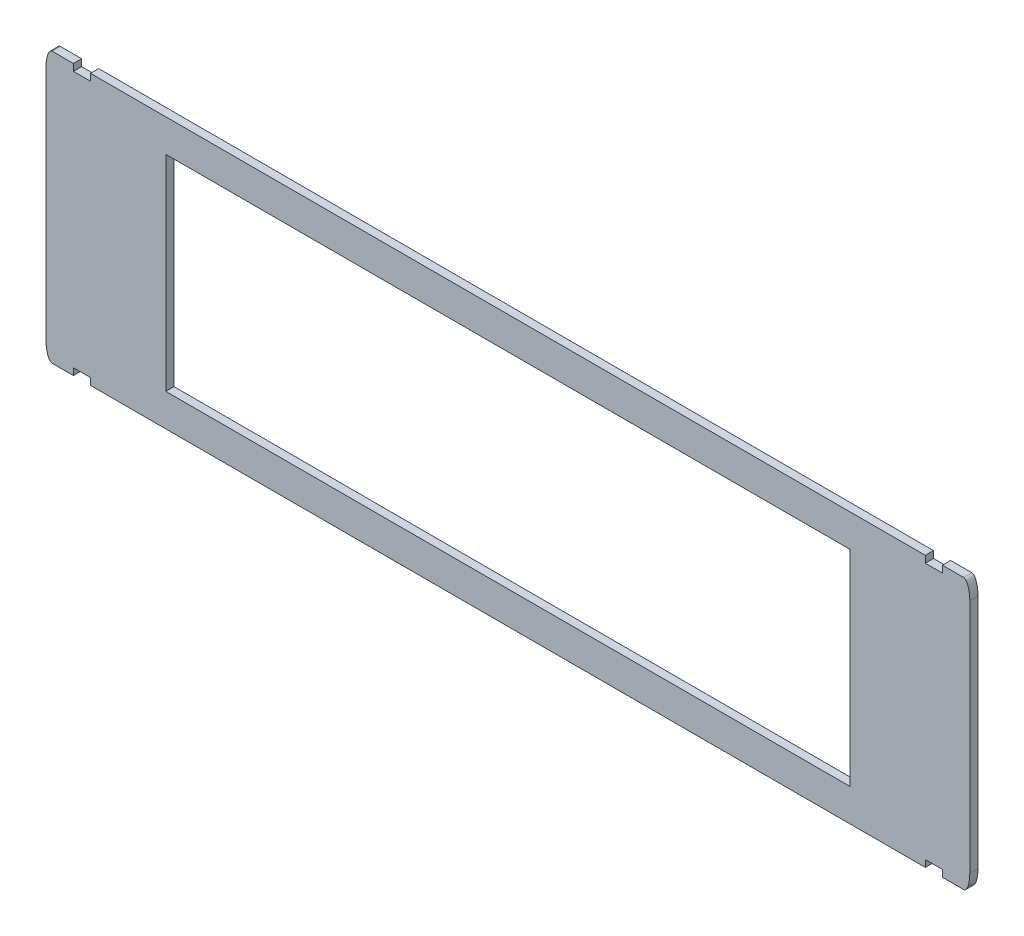
ISO-10303-21;
HEADER;
FILE_DESCRIPTION(('STEP AP214'),'2;1');
FILE_NAME('part.step','',(''),(''),'','','');
FILE_SCHEMA(('AUTOMOTIVE_DESIGN { 1 0 10303 214 1 1 1 1 }'));
ENDSEC;
DATA;
#1=APPLICATION_CONTEXT('core data for automotive mechanical design processes');
#2=APPLICATION_PROTOCOL_DEFINITION('international standard','automotive_design',2000,#1);
#3=PRODUCT_CONTEXT('',#1,'mechanical');
#4=PRODUCT('Part','Part','',(#3));
#5=PRODUCT_RELATED_PRODUCT_CATEGORY('part','',(#4));
#6=PRODUCT_DEFINITION_FORMATION('','',#4);
#7=PRODUCT_DEFINITION_CONTEXT('part definition',#1,'design');
#8=PRODUCT_DEFINITION('design','',#6,#7);
#9=PRODUCT_DEFINITION_SHAPE('','',#8);
#10=(LENGTH_UNIT() NAMED_UNIT(*) SI_UNIT(.MILLI.,.METRE.));
#11=(NAMED_UNIT(*) PLANE_ANGLE_UNIT() SI_UNIT($,.RADIAN.));
#12=(NAMED_UNIT(*) SI_UNIT($,.STERADIAN.) SOLID_ANGLE_UNIT());
#13=UNCERTAINTY_MEASURE_WITH_UNIT(LENGTH_MEASURE(1.E-05),#10,'distance_accuracy_value','');
#14=(GEOMETRIC_REPRESENTATION_CONTEXT(3) GLOBAL_UNCERTAINTY_ASSIGNED_CONTEXT((#13)) GLOBAL_UNIT_ASSIGNED_CONTEXT((#10,
#11,#12)) REPRESENTATION_CONTEXT('',''));
#15=CARTESIAN_POINT('',(0.,0.,0.));
#16=DIRECTION('',(0.,0.,1.));
#17=DIRECTION('',(1.,0.,0.));
#18=AXIS2_PLACEMENT_3D('',#15,#16,#17);
#19=CARTESIAN_POINT('',(-135.,-39.5,2.4));
#20=DIRECTION('',(0.,1.,0.));
#21=DIRECTION('',(0.,0.,1.));
#22=AXIS2_PLACEMENT_3D('',#19,#20,#21);
#23=PLANE('',#22);
#24=DIRECTION('',(1.,0.,0.));
#25=VECTOR('',#24,1.);
#26=CARTESIAN_POINT('',(-135.,-39.5,2.4));
#27=LINE('',#26,#25);
#28=CARTESIAN_POINT('',(127.,-39.5,2.4));
#29=VERTEX_POINT('',#28);
#30=CARTESIAN_POINT('',(133.2,-39.5,2.4));
#31=VERTEX_POINT('',#30);
#32=EDGE_CURVE('E482',#29,#31,#27,.T.);
#33=ORIENTED_EDGE('',*,*,#32,.F.);
#34=DIRECTION('',(0.,0.,-1.));
#35=VECTOR('',#34,1.);
#36=CARTESIAN_POINT('',(127.,-39.5,2.4));
#37=LINE('',#36,#35);
#38=CARTESIAN_POINT('',(127.,-39.5,0.));
#39=VERTEX_POINT('',#38);
#40=EDGE_CURVE('E57',#29,#39,#37,.T.);
#41=ORIENTED_EDGE('',*,*,#40,.T.);
#42=DIRECTION('',(1.,0.,0.));
#43=VECTOR('',#42,1.);
#44=CARTESIAN_POINT('',(-135.,-39.5,0.));
#45=LINE('',#44,#43);
#46=CARTESIAN_POINT('',(133.2,-39.5,0.));
#47=VERTEX_POINT('',#46);
#48=EDGE_CURVE('E463',#39,#47,#45,.T.);
#49=ORIENTED_EDGE('',*,*,#48,.T.);
#50=CARTESIAN_POINT('',(133.2,-39.5,2.52));
#51=CARTESIAN_POINT('',(133.2,-39.5,1.64));
#52=CARTESIAN_POINT('',(133.2,-39.5,0.76));
#53=CARTESIAN_POINT('',(133.2,-39.5,-0.12));
#54=(BOUNDED_CURVE() B_SPLINE_CURVE(3,(#50,#51,#52,#53),.UNSPECIFIED.,.F.,
.F.) B_SPLINE_CURVE_WITH_KNOTS((4,4),(-0.00012,0.00252),
.UNSPECIFIED.) CURVE() GEOMETRIC_REPRESENTATION_ITEM() RATIONAL_B_SPLINE_CURVE((1.,1.,1.,1.)) REPRESENTATION_ITEM(''));
#55=EDGE_CURVE('E653',#47,#31,#54,.F.);
#56=ORIENTED_EDGE('',*,*,#55,.T.);
#57=EDGE_LOOP('',(#33,#41,#49,#56));
#58=FACE_BOUND('',#57,.T.);
#59=ADVANCED_FACE('F44',(#58),#23,.F.);
#60=CARTESIAN_POINT('',(0.,0.,2.4));
#61=DIRECTION('',(0.,0.,1.));
#62=DIRECTION('',(1.,0.,0.));
#63=AXIS2_PLACEMENT_3D('',#60,#61,#62);
#64=PLANE('',#63);
#65=DIRECTION('',(0.,1.,0.));
#66=VECTOR('',#65,1.);
#67=CARTESIAN_POINT('',(127.,-39.5,2.4));
#68=LINE('',#67,#66);
#69=CARTESIAN_POINT('',(127.,-37.5,2.4));
#70=VERTEX_POINT('',#69);
#71=EDGE_CURVE('E247',#29,#70,#68,.T.);
#72=ORIENTED_EDGE('',*,*,#71,.F.);
#73=ORIENTED_EDGE('',*,*,#32,.T.);
#74=CARTESIAN_POINT('',(135.,-34.5,2.4));
#75=CARTESIAN_POINT('',(135.,-39.5,2.4));
#76=CARTESIAN_POINT('',(133.2,-39.5,2.4));
#77=(BOUNDED_CURVE() B_SPLINE_CURVE(2,(#74,#75,#76),.UNSPECIFIED.,.F.,
.F.) B_SPLINE_CURVE_WITH_KNOTS((3,3),(0.,1.),
.UNSPECIFIED.) CURVE() GEOMETRIC_REPRESENTATION_ITEM() RATIONAL_B_SPLINE_CURVE((1.,
0.707106781186548,1.)) REPRESENTATION_ITEM(''));
#78=CARTESIAN_POINT('',(135.,-34.5,2.4));
#79=VERTEX_POINT('',#78);
#80=EDGE_CURVE('E664',#31,#79,#77,.F.);
#81=ORIENTED_EDGE('',*,*,#80,.T.);
#82=DIRECTION('',(0.,1.,0.));
#83=VECTOR('',#82,1.);
#84=CARTESIAN_POINT('',(135.,39.5,2.4));
#85=LINE('',#84,#83);
#86=CARTESIAN_POINT('',(135.,34.5,2.4));
#87=VERTEX_POINT('',#86);
#88=EDGE_CURVE('E394',#79,#87,#85,.T.);
#89=ORIENTED_EDGE('',*,*,#88,.T.);
#90=CARTESIAN_POINT('',(133.2,39.5,2.4));
#91=CARTESIAN_POINT('',(135.,39.5,2.4));
#92=CARTESIAN_POINT('',(135.,34.5,2.4));
#93=(BOUNDED_CURVE() B_SPLINE_CURVE(2,(#90,#91,#92),.UNSPECIFIED.,.F.,
.F.) B_SPLINE_CURVE_WITH_KNOTS((3,3),(0.,1.),
.UNSPECIFIED.) CURVE() GEOMETRIC_REPRESENTATION_ITEM() RATIONAL_B_SPLINE_CURVE((1.,
0.707106781186548,1.)) REPRESENTATION_ITEM(''));
#94=CARTESIAN_POINT('',(133.2,39.5,2.4));
#95=VERTEX_POINT('',#94);
#96=EDGE_CURVE('E662',#87,#95,#93,.F.);
#97=ORIENTED_EDGE('',*,*,#96,.T.);
#98=DIRECTION('',(-1.,0.,0.));
#99=VECTOR('',#98,1.);
#100=CARTESIAN_POINT('',(-135.,39.5,2.4));
#101=LINE('',#100,#99);
#102=CARTESIAN_POINT('',(127.,39.5,2.4));
#103=VERTEX_POINT('',#102);
#104=EDGE_CURVE('E568',#95,#103,#101,.T.);
#105=ORIENTED_EDGE('',*,*,#104,.T.);
#106=DIRECTION('',(0.,-1.,0.));
#107=VECTOR('',#106,1.);
#108=CARTESIAN_POINT('',(127.,39.5,2.4));
#109=LINE('',#108,#107);
#110=CARTESIAN_POINT('',(127.,37.5,2.4));
#111=VERTEX_POINT('',#110);
#112=EDGE_CURVE('E271',#103,#111,#109,.T.);
#113=ORIENTED_EDGE('',*,*,#112,.T.);
#114=DIRECTION('',(-1.,0.,0.));
#115=VECTOR('',#114,1.);
#116=CARTESIAN_POINT('',(127.,37.5,2.4));
#117=LINE('',#116,#115);
#118=CARTESIAN_POINT('',(122.,37.5,2.4));
#119=VERTEX_POINT('',#118);
#120=EDGE_CURVE('E279',#111,#119,#117,.T.);
#121=ORIENTED_EDGE('',*,*,#120,.T.);
#122=DIRECTION('',(0.,1.,0.));
#123=VECTOR('',#122,1.);
#124=CARTESIAN_POINT('',(122.,39.5,2.4));
#125=LINE('',#124,#123);
#126=CARTESIAN_POINT('',(122.,39.5,2.4));
#127=VERTEX_POINT('',#126);
#128=EDGE_CURVE('E275',#119,#127,#125,.T.);
#129=ORIENTED_EDGE('',*,*,#128,.T.);
#130=CARTESIAN_POINT('',(-122.,39.5,2.4));
#131=VERTEX_POINT('',#130);
#132=EDGE_CURVE('E566',#127,#131,#101,.T.);
#133=ORIENTED_EDGE('',*,*,#132,.T.);
#134=DIRECTION('',(0.,1.,0.));
#135=VECTOR('',#134,1.);
#136=CARTESIAN_POINT('',(-122.,39.5,2.4));
#137=LINE('',#136,#135);
#138=CARTESIAN_POINT('',(-122.,37.5,2.4));
#139=VERTEX_POINT('',#138);
#140=EDGE_CURVE('E327',#139,#131,#137,.T.);
#141=ORIENTED_EDGE('',*,*,#140,.F.);
#142=DIRECTION('',(1.,0.,0.));
#143=VECTOR('',#142,1.);
#144=CARTESIAN_POINT('',(-127.,37.5,2.4));
#145=LINE('',#144,#143);
#146=CARTESIAN_POINT('',(-127.,37.5,2.4));
#147=VERTEX_POINT('',#146);
#148=EDGE_CURVE('E323',#147,#139,#145,.T.);
#149=ORIENTED_EDGE('',*,*,#148,.F.);
#150=DIRECTION('',(0.,-1.,0.));
#151=VECTOR('',#150,1.);
#152=CARTESIAN_POINT('',(-127.,39.5,2.4));
#153=LINE('',#152,#151);
#154=CARTESIAN_POINT('',(-127.,39.5,2.4));
#155=VERTEX_POINT('',#154);
#156=EDGE_CURVE('E310',#155,#147,#153,.T.);
#157=ORIENTED_EDGE('',*,*,#156,.F.);
#158=CARTESIAN_POINT('',(-133.2,39.5,2.4));
#159=VERTEX_POINT('',#158);
#160=EDGE_CURVE('E399',#155,#159,#101,.T.);
#161=ORIENTED_EDGE('',*,*,#160,.T.);
#162=CARTESIAN_POINT('',(-135.,34.5,2.4));
#163=CARTESIAN_POINT('',(-135.,39.5,2.4));
#164=CARTESIAN_POINT('',(-133.2,39.5,2.4));
#165=(BOUNDED_CURVE() B_SPLINE_CURVE(2,(#162,#163,#164),.UNSPECIFIED.,.F.,
.F.) B_SPLINE_CURVE_WITH_KNOTS((3,3),(0.,1.),
.UNSPECIFIED.) CURVE() GEOMETRIC_REPRESENTATION_ITEM() RATIONAL_B_SPLINE_CURVE((1.,
0.707106781186548,1.)) REPRESENTATION_ITEM(''));
#166=CARTESIAN_POINT('',(-135.,34.5,2.4));
#167=VERTEX_POINT('',#166);
#168=EDGE_CURVE('E655',#159,#167,#165,.F.);
#169=ORIENTED_EDGE('',*,*,#168,.T.);
#170=DIRECTION('',(0.,-1.,0.));
#171=VECTOR('',#170,1.);
#172=CARTESIAN_POINT('',(-135.,39.5,2.4));
#173=LINE('',#172,#171);
#174=CARTESIAN_POINT('',(-135.,-34.5,2.4));
#175=VERTEX_POINT('',#174);
#176=EDGE_CURVE('E496',#167,#175,#173,.T.);
#177=ORIENTED_EDGE('',*,*,#176,.T.);
#178=CARTESIAN_POINT('',(-133.2,-39.5,2.4));
#179=CARTESIAN_POINT('',(-135.,-39.5,2.4));
#180=CARTESIAN_POINT('',(-135.,-34.5,2.4));
#181=(BOUNDED_CURVE() B_SPLINE_CURVE(2,(#178,#179,#180),.UNSPECIFIED.,.F.,
.F.) B_SPLINE_CURVE_WITH_KNOTS((3,3),(0.,1.),
.UNSPECIFIED.) CURVE() GEOMETRIC_REPRESENTATION_ITEM() RATIONAL_B_SPLINE_CURVE((1.,
0.707106781186548,1.)) REPRESENTATION_ITEM(''));
#182=CARTESIAN_POINT('',(-133.2,-39.5,2.4));
#183=VERTEX_POINT('',#182);
#184=EDGE_CURVE('E635',#175,#183,#181,.F.);
#185=ORIENTED_EDGE('',*,*,#184,.T.);
#186=CARTESIAN_POINT('',(-127.,-39.5,2.4));
#187=VERTEX_POINT('',#186);
#188=EDGE_CURVE('E481',#183,#187,#27,.T.);
#189=ORIENTED_EDGE('',*,*,#188,.T.);
#190=DIRECTION('',(0.,1.,0.));
#191=VECTOR('',#190,1.);
#192=CARTESIAN_POINT('',(-127.,-39.5,2.4));
#193=LINE('',#192,#191);
#194=CARTESIAN_POINT('',(-127.,-37.5,2.4));
#195=VERTEX_POINT('',#194);
#196=EDGE_CURVE('E294',#187,#195,#193,.T.);
#197=ORIENTED_EDGE('',*,*,#196,.T.);
#198=DIRECTION('',(1.,0.,0.));
#199=VECTOR('',#198,1.);
#200=CARTESIAN_POINT('',(-127.,-37.5,2.4));
#201=LINE('',#200,#199);
#202=CARTESIAN_POINT('',(-122.,-37.5,2.4));
#203=VERTEX_POINT('',#202);
#204=EDGE_CURVE('E302',#195,#203,#201,.T.);
#205=ORIENTED_EDGE('',*,*,#204,.T.);
#206=DIRECTION('',(0.,-1.,0.));
#207=VECTOR('',#206,1.);
#208=CARTESIAN_POINT('',(-122.,-39.5,2.4));
#209=LINE('',#208,#207);
#210=CARTESIAN_POINT('',(-122.,-39.5,2.4));
#211=VERTEX_POINT('',#210);
#212=EDGE_CURVE('E298',#203,#211,#209,.T.);
#213=ORIENTED_EDGE('',*,*,#212,.T.);
#214=CARTESIAN_POINT('',(122.,-39.5,2.4));
#215=VERTEX_POINT('',#214);
#216=EDGE_CURVE('E477',#211,#215,#27,.T.);
#217=ORIENTED_EDGE('',*,*,#216,.T.);
#218=DIRECTION('',(0.,-1.,0.));
#219=VECTOR('',#218,1.);
#220=CARTESIAN_POINT('',(122.,-39.5,2.4));
#221=LINE('',#220,#219);
#222=CARTESIAN_POINT('',(122.,-37.5,2.4));
#223=VERTEX_POINT('',#222);
#224=EDGE_CURVE('E64',#223,#215,#221,.T.);
#225=ORIENTED_EDGE('',*,*,#224,.F.);
#226=DIRECTION('',(-1.,0.,0.));
#227=VECTOR('',#226,1.);
#228=CARTESIAN_POINT('',(127.,-37.5,2.4));
#229=LINE('',#228,#227);
#230=EDGE_CURVE('E240',#70,#223,#229,.T.);
#231=ORIENTED_EDGE('',*,*,#230,.F.);
#232=EDGE_LOOP('',(#72,#73,#81,#89,#97,#105,#113,#121,#129,#133,#141,#149,#157,#161,#169,#177,
#185,#189,#197,#205,#213,#217,#225,#231));
#233=FACE_BOUND('',#232,.T.);
#234=DIRECTION('',(0.,1.,0.));
#235=VECTOR('',#234,1.);
#236=CARTESIAN_POINT('',(100.,30.,2.4));
#237=LINE('',#236,#235);
#238=CARTESIAN_POINT('',(100.,-30.,2.4));
#239=VERTEX_POINT('',#238);
#240=CARTESIAN_POINT('',(100.,30.,2.4));
#241=VERTEX_POINT('',#240);
#242=EDGE_CURVE('E335',#239,#241,#237,.T.);
#243=ORIENTED_EDGE('',*,*,#242,.F.);
#244=DIRECTION('',(1.,0.,0.));
#245=VECTOR('',#244,1.);
#246=CARTESIAN_POINT('',(-100.,-30.,2.4));
#247=LINE('',#246,#245);
#248=CARTESIAN_POINT('',(-100.,-30.,2.4));
#249=VERTEX_POINT('',#248);
#250=EDGE_CURVE('E350',#249,#239,#247,.T.);
#251=ORIENTED_EDGE('',*,*,#250,.F.);
#252=DIRECTION('',(0.,-1.,0.));
#253=VECTOR('',#252,1.);
#254=CARTESIAN_POINT('',(-100.,30.,2.4));
#255=LINE('',#254,#253);
#256=CARTESIAN_POINT('',(-100.,30.,2.4));
#257=VERTEX_POINT('',#256);
#258=EDGE_CURVE('E369',#257,#249,#255,.T.);
#259=ORIENTED_EDGE('',*,*,#258,.F.);
#260=DIRECTION('',(-1.,0.,0.));
#261=VECTOR('',#260,1.);
#262=CARTESIAN_POINT('',(-100.,30.,2.4));
#263=LINE('',#262,#261);
#264=EDGE_CURVE('E365',#241,#257,#263,.T.);
#265=ORIENTED_EDGE('',*,*,#264,.F.);
#266=EDGE_LOOP('',(#243,#251,#259,#265));
#267=FACE_BOUND('',#266,.T.);
#268=ADVANCED_FACE('F254',(#233,#267),#64,.T.);
#269=CARTESIAN_POINT('',(0.,0.,0.));
#270=DIRECTION('',(0.,0.,1.));
#271=DIRECTION('',(1.,0.,0.));
#272=AXIS2_PLACEMENT_3D('',#269,#270,#271);
#273=PLANE('',#272);
#274=ORIENTED_EDGE('',*,*,#48,.F.);
#275=DIRECTION('',(0.,1.,0.));
#276=VECTOR('',#275,1.);
#277=CARTESIAN_POINT('',(127.,0.,0.));
#278=LINE('',#277,#276);
#279=CARTESIAN_POINT('',(127.,-37.5,0.));
#280=VERTEX_POINT('',#279);
#281=EDGE_CURVE('E268',#39,#280,#278,.T.);
#282=ORIENTED_EDGE('',*,*,#281,.T.);
#283=DIRECTION('',(-1.,0.,0.));
#284=VECTOR('',#283,1.);
#285=CARTESIAN_POINT('',(0.,-37.5,0.));
#286=LINE('',#285,#284);
#287=CARTESIAN_POINT('',(122.,-37.5,0.));
#288=VERTEX_POINT('',#287);
#289=EDGE_CURVE('E12',#280,#288,#286,.T.);
#290=ORIENTED_EDGE('',*,*,#289,.T.);
#291=DIRECTION('',(0.,-1.,0.));
#292=VECTOR('',#291,1.);
#293=CARTESIAN_POINT('',(122.,0.,0.));
#294=LINE('',#293,#292);
#295=CARTESIAN_POINT('',(122.,-39.5,0.));
#296=VERTEX_POINT('',#295);
#297=EDGE_CURVE('E263',#288,#296,#294,.T.);
#298=ORIENTED_EDGE('',*,*,#297,.T.);
#299=CARTESIAN_POINT('',(-122.,-39.5,0.));
#300=VERTEX_POINT('',#299);
#301=EDGE_CURVE('E448',#300,#296,#45,.T.);
#302=ORIENTED_EDGE('',*,*,#301,.F.);
#303=DIRECTION('',(0.,-1.,0.));
#304=VECTOR('',#303,1.);
#305=CARTESIAN_POINT('',(-122.,0.,0.));
#306=LINE('',#305,#304);
#307=CARTESIAN_POINT('',(-122.,-37.5,0.));
#308=VERTEX_POINT('',#307);
#309=EDGE_CURVE('E465',#308,#300,#306,.T.);
#310=ORIENTED_EDGE('',*,*,#309,.F.);
#311=DIRECTION('',(1.,0.,0.));
#312=VECTOR('',#311,1.);
#313=CARTESIAN_POINT('',(0.,-37.5,0.));
#314=LINE('',#313,#312);
#315=CARTESIAN_POINT('',(-127.,-37.5,0.));
#316=VERTEX_POINT('',#315);
#317=EDGE_CURVE('E468',#316,#308,#314,.T.);
#318=ORIENTED_EDGE('',*,*,#317,.F.);
#319=DIRECTION('',(0.,1.,0.));
#320=VECTOR('',#319,1.);
#321=CARTESIAN_POINT('',(-127.,0.,0.));
#322=LINE('',#321,#320);
#323=CARTESIAN_POINT('',(-127.,-39.5,0.));
#324=VERTEX_POINT('',#323);
#325=EDGE_CURVE('E473',#324,#316,#322,.T.);
#326=ORIENTED_EDGE('',*,*,#325,.F.);
#327=CARTESIAN_POINT('',(-133.2,-39.5,0.));
#328=VERTEX_POINT('',#327);
#329=EDGE_CURVE('E400',#328,#324,#45,.T.);
#330=ORIENTED_EDGE('',*,*,#329,.F.);
#331=CARTESIAN_POINT('',(-135.,-34.5,0.));
#332=CARTESIAN_POINT('',(-135.,-39.5,0.));
#333=CARTESIAN_POINT('',(-133.2,-39.5,0.));
#334=(BOUNDED_CURVE() B_SPLINE_CURVE(2,(#331,#332,#333),.UNSPECIFIED.,.F.,
.F.) B_SPLINE_CURVE_WITH_KNOTS((3,3),(0.,1.),
.UNSPECIFIED.) CURVE() GEOMETRIC_REPRESENTATION_ITEM() RATIONAL_B_SPLINE_CURVE((1.,
0.707106781186548,1.)) REPRESENTATION_ITEM(''));
#335=CARTESIAN_POINT('',(-135.,-34.5,0.));
#336=VERTEX_POINT('',#335);
#337=EDGE_CURVE('E644',#328,#336,#334,.F.);
#338=ORIENTED_EDGE('',*,*,#337,.T.);
#339=DIRECTION('',(0.,-1.,0.));
#340=VECTOR('',#339,1.);
#341=CARTESIAN_POINT('',(-135.,39.5,0.));
#342=LINE('',#341,#340);
#343=CARTESIAN_POINT('',(-135.,34.5,0.));
#344=VERTEX_POINT('',#343);
#345=EDGE_CURVE('E449',#344,#336,#342,.T.);
#346=ORIENTED_EDGE('',*,*,#345,.F.);
#347=CARTESIAN_POINT('',(-133.2,39.5,0.));
#348=CARTESIAN_POINT('',(-135.,39.5,0.));
#349=CARTESIAN_POINT('',(-135.,34.5,0.));
#350=(BOUNDED_CURVE() B_SPLINE_CURVE(2,(#347,#348,#349),.UNSPECIFIED.,.F.,
.F.) B_SPLINE_CURVE_WITH_KNOTS((3,3),(0.,1.),
.UNSPECIFIED.) CURVE() GEOMETRIC_REPRESENTATION_ITEM() RATIONAL_B_SPLINE_CURVE((1.,
0.707106781186548,1.)) REPRESENTATION_ITEM(''));
#351=CARTESIAN_POINT('',(-133.2,39.5,0.));
#352=VERTEX_POINT('',#351);
#353=EDGE_CURVE('E641',#344,#352,#350,.F.);
#354=ORIENTED_EDGE('',*,*,#353,.T.);
#355=DIRECTION('',(-1.,0.,0.));
#356=VECTOR('',#355,1.);
#357=CARTESIAN_POINT('',(-135.,39.5,0.));
#358=LINE('',#357,#356);
#359=CARTESIAN_POINT('',(-127.,39.5,0.));
#360=VERTEX_POINT('',#359);
#361=EDGE_CURVE('E528',#360,#352,#358,.T.);
#362=ORIENTED_EDGE('',*,*,#361,.F.);
#363=DIRECTION('',(0.,-1.,0.));
#364=VECTOR('',#363,1.);
#365=CARTESIAN_POINT('',(-127.,0.,0.));
#366=LINE('',#365,#364);
#367=CARTESIAN_POINT('',(-127.,37.5,0.));
#368=VERTEX_POINT('',#367);
#369=EDGE_CURVE('E469',#360,#368,#366,.T.);
#370=ORIENTED_EDGE('',*,*,#369,.T.);
#371=DIRECTION('',(1.,0.,0.));
#372=VECTOR('',#371,1.);
#373=CARTESIAN_POINT('',(0.,37.5,0.));
#374=LINE('',#373,#372);
#375=CARTESIAN_POINT('',(-122.,37.5,0.));
#376=VERTEX_POINT('',#375);
#377=EDGE_CURVE('E542',#368,#376,#374,.T.);
#378=ORIENTED_EDGE('',*,*,#377,.T.);
#379=DIRECTION('',(0.,1.,0.));
#380=VECTOR('',#379,1.);
#381=CARTESIAN_POINT('',(-122.,0.,0.));
#382=LINE('',#381,#380);
#383=CARTESIAN_POINT('',(-122.,39.5,0.));
#384=VERTEX_POINT('',#383);
#385=EDGE_CURVE('E546',#376,#384,#382,.T.);
#386=ORIENTED_EDGE('',*,*,#385,.T.);
#387=CARTESIAN_POINT('',(122.,39.5,0.));
#388=VERTEX_POINT('',#387);
#389=EDGE_CURVE('E483',#388,#384,#358,.T.);
#390=ORIENTED_EDGE('',*,*,#389,.F.);
#391=DIRECTION('',(0.,1.,0.));
#392=VECTOR('',#391,1.);
#393=CARTESIAN_POINT('',(122.,0.,0.));
#394=LINE('',#393,#392);
#395=CARTESIAN_POINT('',(122.,37.5,0.));
#396=VERTEX_POINT('',#395);
#397=EDGE_CURVE('E72',#396,#388,#394,.T.);
#398=ORIENTED_EDGE('',*,*,#397,.F.);
#399=DIRECTION('',(-1.,0.,0.));
#400=VECTOR('',#399,1.);
#401=CARTESIAN_POINT('',(0.,37.5,0.));
#402=LINE('',#401,#400);
#403=CARTESIAN_POINT('',(127.,37.5,0.));
#404=VERTEX_POINT('',#403);
#405=EDGE_CURVE('E500',#404,#396,#402,.T.);
#406=ORIENTED_EDGE('',*,*,#405,.F.);
#407=DIRECTION('',(0.,-1.,0.));
#408=VECTOR('',#407,1.);
#409=CARTESIAN_POINT('',(127.,0.,0.));
#410=LINE('',#409,#408);
#411=CARTESIAN_POINT('',(127.,39.5,0.));
#412=VERTEX_POINT('',#411);
#413=EDGE_CURVE('E291',#412,#404,#410,.T.);
#414=ORIENTED_EDGE('',*,*,#413,.F.);
#415=CARTESIAN_POINT('',(133.2,39.5,0.));
#416=VERTEX_POINT('',#415);
#417=EDGE_CURVE('E516',#416,#412,#358,.T.);
#418=ORIENTED_EDGE('',*,*,#417,.F.);
#419=CARTESIAN_POINT('',(135.,34.5,0.));
#420=CARTESIAN_POINT('',(135.,39.5,0.));
#421=CARTESIAN_POINT('',(133.2,39.5,0.));
#422=(BOUNDED_CURVE() B_SPLINE_CURVE(2,(#419,#420,#421),.UNSPECIFIED.,.F.,
.F.) B_SPLINE_CURVE_WITH_KNOTS((3,3),(0.,1.),
.UNSPECIFIED.) CURVE() GEOMETRIC_REPRESENTATION_ITEM() RATIONAL_B_SPLINE_CURVE((1.,
0.707106781186548,1.)) REPRESENTATION_ITEM(''));
#423=CARTESIAN_POINT('',(135.,34.5,0.));
#424=VERTEX_POINT('',#423);
#425=EDGE_CURVE('E646',#416,#424,#422,.F.);
#426=ORIENTED_EDGE('',*,*,#425,.T.);
#427=DIRECTION('',(0.,1.,0.));
#428=VECTOR('',#427,1.);
#429=CARTESIAN_POINT('',(135.,39.5,0.));
#430=LINE('',#429,#428);
#431=CARTESIAN_POINT('',(135.,-34.5,0.));
#432=VERTEX_POINT('',#431);
#433=EDGE_CURVE('E379',#432,#424,#430,.T.);
#434=ORIENTED_EDGE('',*,*,#433,.F.);
#435=CARTESIAN_POINT('',(133.2,-39.5,0.));
#436=CARTESIAN_POINT('',(135.,-39.5,0.));
#437=CARTESIAN_POINT('',(135.,-34.5,0.));
#438=(BOUNDED_CURVE() B_SPLINE_CURVE(2,(#435,#436,#437),.UNSPECIFIED.,.F.,
.F.) B_SPLINE_CURVE_WITH_KNOTS((3,3),(0.,1.),
.UNSPECIFIED.) CURVE() GEOMETRIC_REPRESENTATION_ITEM() RATIONAL_B_SPLINE_CURVE((1.,
0.707106781186548,1.)) REPRESENTATION_ITEM(''));
#439=EDGE_CURVE('E510',#432,#47,#438,.F.);
#440=ORIENTED_EDGE('',*,*,#439,.T.);
#441=EDGE_LOOP('',(#274,#282,#290,#298,#302,#310,#318,#326,#330,#338,#346,#354,#362,#370,#378,
#386,#390,#398,#406,#414,#418,#426,#434,#440));
#442=FACE_BOUND('',#441,.T.);
#443=DIRECTION('',(1.,0.,0.));
#444=VECTOR('',#443,1.);
#445=CARTESIAN_POINT('',(-100.,-30.,0.));
#446=LINE('',#445,#444);
#447=CARTESIAN_POINT('',(-100.,-30.,0.));
#448=VERTEX_POINT('',#447);
#449=CARTESIAN_POINT('',(100.,-30.,0.));
#450=VERTEX_POINT('',#449);
#451=EDGE_CURVE('E358',#448,#450,#446,.T.);
#452=ORIENTED_EDGE('',*,*,#451,.T.);
#453=DIRECTION('',(0.,1.,0.));
#454=VECTOR('',#453,1.);
#455=CARTESIAN_POINT('',(100.,30.,0.));
#456=LINE('',#455,#454);
#457=CARTESIAN_POINT('',(100.,30.,0.));
#458=VERTEX_POINT('',#457);
#459=EDGE_CURVE('E345',#450,#458,#456,.T.);
#460=ORIENTED_EDGE('',*,*,#459,.T.);
#461=DIRECTION('',(-1.,0.,0.));
#462=VECTOR('',#461,1.);
#463=CARTESIAN_POINT('',(-100.,30.,0.));
#464=LINE('',#463,#462);
#465=CARTESIAN_POINT('',(-100.,30.,0.));
#466=VERTEX_POINT('',#465);
#467=EDGE_CURVE('E349',#458,#466,#464,.T.);
#468=ORIENTED_EDGE('',*,*,#467,.T.);
#469=DIRECTION('',(0.,-1.,0.));
#470=VECTOR('',#469,1.);
#471=CARTESIAN_POINT('',(-100.,30.,0.));
#472=LINE('',#471,#470);
#473=EDGE_CURVE('E354',#466,#448,#472,.T.);
#474=ORIENTED_EDGE('',*,*,#473,.T.);
#475=EDGE_LOOP('',(#452,#460,#468,#474));
#476=FACE_BOUND('',#475,.T.);
#477=ADVANCED_FACE('F507',(#442,#476),#273,.F.);
#478=CARTESIAN_POINT('',(-135.,39.5,2.4));
#479=DIRECTION('',(0.,-1.,0.));
#480=DIRECTION('',(0.,0.,-1.));
#481=AXIS2_PLACEMENT_3D('',#478,#479,#480);
#482=PLANE('',#481);
#483=DIRECTION('',(0.,0.,-1.));
#484=VECTOR('',#483,1.);
#485=CARTESIAN_POINT('',(127.,39.5,2.4));
#486=LINE('',#485,#484);
#487=EDGE_CURVE('E577',#103,#412,#486,.T.);
#488=ORIENTED_EDGE('',*,*,#487,.F.);
#489=ORIENTED_EDGE('',*,*,#104,.F.);
#490=CARTESIAN_POINT('',(133.2,39.5,-0.12));
#491=CARTESIAN_POINT('',(133.2,39.5,0.76));
#492=CARTESIAN_POINT('',(133.2,39.5,1.64));
#493=CARTESIAN_POINT('',(133.2,39.5,2.52));
#494=(BOUNDED_CURVE() B_SPLINE_CURVE(3,(#490,#491,#492,#493),.UNSPECIFIED.,.F.,
.F.) B_SPLINE_CURVE_WITH_KNOTS((4,4),(-0.00012,0.00252),
.UNSPECIFIED.) CURVE() GEOMETRIC_REPRESENTATION_ITEM() RATIONAL_B_SPLINE_CURVE((1.,1.,1.,1.)) REPRESENTATION_ITEM(''));
#495=EDGE_CURVE('E671',#95,#416,#494,.F.);
#496=ORIENTED_EDGE('',*,*,#495,.T.);
#497=ORIENTED_EDGE('',*,*,#417,.T.);
#498=EDGE_LOOP('',(#488,#489,#496,#497));
#499=FACE_BOUND('',#498,.T.);
#500=ADVANCED_FACE('F427',(#499),#482,.F.);
#501=DIRECTION('',(0.,0.,1.));
#502=VECTOR('',#501,1.);
#503=CARTESIAN_POINT('',(122.,39.5,2.4));
#504=LINE('',#503,#502);
#505=EDGE_CURVE('E476',#388,#127,#504,.T.);
#506=ORIENTED_EDGE('',*,*,#505,.F.);
#507=ORIENTED_EDGE('',*,*,#389,.T.);
#508=DIRECTION('',(0.,0.,1.));
#509=VECTOR('',#508,1.);
#510=CARTESIAN_POINT('',(-122.,39.5,-0.0170000000000001));
#511=LINE('',#510,#509);
#512=EDGE_CURVE('E336',#384,#131,#511,.T.);
#513=ORIENTED_EDGE('',*,*,#512,.T.);
#514=ORIENTED_EDGE('',*,*,#132,.F.);
#515=EDGE_LOOP('',(#506,#507,#513,#514));
#516=FACE_BOUND('',#515,.T.);
#517=ADVANCED_FACE('F592',(#516),#482,.F.);
#518=DIRECTION('',(0.,0.,1.));
#519=VECTOR('',#518,1.);
#520=CARTESIAN_POINT('',(-127.,-39.5,-0.0170000000000001));
#521=LINE('',#520,#519);
#522=EDGE_CURVE('E306',#324,#187,#521,.T.);
#523=ORIENTED_EDGE('',*,*,#522,.T.);
#524=ORIENTED_EDGE('',*,*,#188,.F.);
#525=CARTESIAN_POINT('',(-133.2,-39.5,-0.12));
#526=CARTESIAN_POINT('',(-133.2,-39.5,0.76));
#527=CARTESIAN_POINT('',(-133.2,-39.5,1.64));
#528=CARTESIAN_POINT('',(-133.2,-39.5,2.52));
#529=(BOUNDED_CURVE() B_SPLINE_CURVE(3,(#525,#526,#527,#528),.UNSPECIFIED.,.F.,
.F.) B_SPLINE_CURVE_WITH_KNOTS((4,4),(-0.00012,0.00252),
.UNSPECIFIED.) CURVE() GEOMETRIC_REPRESENTATION_ITEM() RATIONAL_B_SPLINE_CURVE((1.,1.,1.,1.)) REPRESENTATION_ITEM(''));
#530=EDGE_CURVE('E651',#183,#328,#529,.F.);
#531=ORIENTED_EDGE('',*,*,#530,.T.);
#532=ORIENTED_EDGE('',*,*,#329,.T.);
#533=EDGE_LOOP('',(#523,#524,#531,#532));
#534=FACE_BOUND('',#533,.T.);
#535=ADVANCED_FACE('F613',(#534),#23,.F.);
#536=ORIENTED_EDGE('',*,*,#301,.T.);
#537=DIRECTION('',(0.,0.,1.));
#538=VECTOR('',#537,1.);
#539=CARTESIAN_POINT('',(122.,-39.5,2.4));
#540=LINE('',#539,#538);
#541=EDGE_CURVE('E498',#296,#215,#540,.T.);
#542=ORIENTED_EDGE('',*,*,#541,.T.);
#543=ORIENTED_EDGE('',*,*,#216,.F.);
#544=DIRECTION('',(0.,0.,1.));
#545=VECTOR('',#544,1.);
#546=CARTESIAN_POINT('',(-122.,-39.5,-0.0170000000000001));
#547=LINE('',#546,#545);
#548=EDGE_CURVE('E314',#300,#211,#547,.T.);
#549=ORIENTED_EDGE('',*,*,#548,.F.);
#550=EDGE_LOOP('',(#536,#542,#543,#549));
#551=FACE_BOUND('',#550,.T.);
#552=ADVANCED_FACE('F612',(#551),#23,.F.);
#553=ORIENTED_EDGE('',*,*,#160,.F.);
#554=DIRECTION('',(0.,0.,1.));
#555=VECTOR('',#554,1.);
#556=CARTESIAN_POINT('',(-127.,39.5,-0.0170000000000001));
#557=LINE('',#556,#555);
#558=EDGE_CURVE('E332',#360,#155,#557,.T.);
#559=ORIENTED_EDGE('',*,*,#558,.F.);
#560=ORIENTED_EDGE('',*,*,#361,.T.);
#561=CARTESIAN_POINT('',(-133.2,39.5,2.52));
#562=CARTESIAN_POINT('',(-133.2,39.5,1.64));
#563=CARTESIAN_POINT('',(-133.2,39.5,0.76));
#564=CARTESIAN_POINT('',(-133.2,39.5,-0.12));
#565=(BOUNDED_CURVE() B_SPLINE_CURVE(3,(#561,#562,#563,#564),.UNSPECIFIED.,.F.,
.F.) B_SPLINE_CURVE_WITH_KNOTS((4,4),(-0.00012,0.00252),
.UNSPECIFIED.) CURVE() GEOMETRIC_REPRESENTATION_ITEM() RATIONAL_B_SPLINE_CURVE((1.,1.,1.,1.)) REPRESENTATION_ITEM(''));
#566=EDGE_CURVE('E562',#352,#159,#565,.F.);
#567=ORIENTED_EDGE('',*,*,#566,.T.);
#568=EDGE_LOOP('',(#553,#559,#560,#567));
#569=FACE_BOUND('',#568,.T.);
#570=ADVANCED_FACE('F426',(#569),#482,.F.);
#571=CARTESIAN_POINT('',(135.,39.5,2.4));
#572=DIRECTION('',(-1.,0.,0.));
#573=DIRECTION('',(0.,0.,1.));
#574=AXIS2_PLACEMENT_3D('',#571,#572,#573);
#575=PLANE('',#574);
#576=ORIENTED_EDGE('',*,*,#88,.F.);
#577=CARTESIAN_POINT('',(135.,-34.5,-0.12));
#578=CARTESIAN_POINT('',(135.,-34.5,0.76));
#579=CARTESIAN_POINT('',(135.,-34.5,1.64));
#580=CARTESIAN_POINT('',(135.,-34.5,2.52));
#581=(BOUNDED_CURVE() B_SPLINE_CURVE(3,(#577,#578,#579,#580),.UNSPECIFIED.,.F.,
.F.) B_SPLINE_CURVE_WITH_KNOTS((4,4),(-0.00012,0.00252),
.UNSPECIFIED.) CURVE() GEOMETRIC_REPRESENTATION_ITEM() RATIONAL_B_SPLINE_CURVE((1.,1.,1.,1.)) REPRESENTATION_ITEM(''));
#582=EDGE_CURVE('E639',#79,#432,#581,.F.);
#583=ORIENTED_EDGE('',*,*,#582,.T.);
#584=ORIENTED_EDGE('',*,*,#433,.T.);
#585=CARTESIAN_POINT('',(135.,34.5,2.52));
#586=CARTESIAN_POINT('',(135.,34.5,1.64));
#587=CARTESIAN_POINT('',(135.,34.5,0.76));
#588=CARTESIAN_POINT('',(135.,34.5,-0.12));
#589=(BOUNDED_CURVE() B_SPLINE_CURVE(3,(#585,#586,#587,#588),.UNSPECIFIED.,.F.,
.F.) B_SPLINE_CURVE_WITH_KNOTS((4,4),(-0.00012,0.00252),
.UNSPECIFIED.) CURVE() GEOMETRIC_REPRESENTATION_ITEM() RATIONAL_B_SPLINE_CURVE((1.,1.,1.,1.)) REPRESENTATION_ITEM(''));
#590=EDGE_CURVE('E408',#424,#87,#589,.F.);
#591=ORIENTED_EDGE('',*,*,#590,.T.);
#592=EDGE_LOOP('',(#576,#583,#584,#591));
#593=FACE_BOUND('',#592,.T.);
#594=ADVANCED_FACE('F415',(#593),#575,.F.);
#595=CARTESIAN_POINT('',(-135.,39.5,2.4));
#596=DIRECTION('',(1.,0.,0.));
#597=DIRECTION('',(0.,0.,-1.));
#598=AXIS2_PLACEMENT_3D('',#595,#596,#597);
#599=PLANE('',#598);
#600=ORIENTED_EDGE('',*,*,#345,.T.);
#601=CARTESIAN_POINT('',(-135.,-34.5,2.52));
#602=CARTESIAN_POINT('',(-135.,-34.5,1.64));
#603=CARTESIAN_POINT('',(-135.,-34.5,0.76));
#604=CARTESIAN_POINT('',(-135.,-34.5,-0.12));
#605=(BOUNDED_CURVE() B_SPLINE_CURVE(3,(#601,#602,#603,#604),.UNSPECIFIED.,.F.,
.F.) B_SPLINE_CURVE_WITH_KNOTS((4,4),(-0.00012,0.00252),
.UNSPECIFIED.) CURVE() GEOMETRIC_REPRESENTATION_ITEM() RATIONAL_B_SPLINE_CURVE((1.,1.,1.,1.)) REPRESENTATION_ITEM(''));
#606=EDGE_CURVE('E547',#336,#175,#605,.F.);
#607=ORIENTED_EDGE('',*,*,#606,.T.);
#608=ORIENTED_EDGE('',*,*,#176,.F.);
#609=CARTESIAN_POINT('',(-135.,34.5,-0.12));
#610=CARTESIAN_POINT('',(-135.,34.5,0.76));
#611=CARTESIAN_POINT('',(-135.,34.5,1.64));
#612=CARTESIAN_POINT('',(-135.,34.5,2.52));
#613=(BOUNDED_CURVE() B_SPLINE_CURVE(3,(#609,#610,#611,#612),.UNSPECIFIED.,.F.,
.F.) B_SPLINE_CURVE_WITH_KNOTS((4,4),(-0.00012,0.00252),
.UNSPECIFIED.) CURVE() GEOMETRIC_REPRESENTATION_ITEM() RATIONAL_B_SPLINE_CURVE((1.,1.,1.,1.)) REPRESENTATION_ITEM(''));
#614=EDGE_CURVE('E673',#167,#344,#613,.F.);
#615=ORIENTED_EDGE('',*,*,#614,.T.);
#616=EDGE_LOOP('',(#600,#607,#608,#615));
#617=FACE_BOUND('',#616,.T.);
#618=ADVANCED_FACE('F425',(#617),#599,.F.);
#619=CARTESIAN_POINT('',(100.,30.,0.));
#620=DIRECTION('',(1.,0.,0.));
#621=DIRECTION('',(0.,1.,0.));
#622=AXIS2_PLACEMENT_3D('',#619,#620,#621);
#623=PLANE('',#622);
#624=ORIENTED_EDGE('',*,*,#242,.T.);
#625=DIRECTION('',(0.,0.,1.));
#626=VECTOR('',#625,1.);
#627=CARTESIAN_POINT('',(100.,30.,0.));
#628=LINE('',#627,#626);
#629=EDGE_CURVE('E362',#458,#241,#628,.T.);
#630=ORIENTED_EDGE('',*,*,#629,.F.);
#631=ORIENTED_EDGE('',*,*,#459,.F.);
#632=DIRECTION('',(0.,0.,1.));
#633=VECTOR('',#632,1.);
#634=CARTESIAN_POINT('',(100.,-30.,0.));
#635=LINE('',#634,#633);
#636=EDGE_CURVE('E376',#450,#239,#635,.T.);
#637=ORIENTED_EDGE('',*,*,#636,.T.);
#638=EDGE_LOOP('',(#624,#630,#631,#637));
#639=FACE_BOUND('',#638,.T.);
#640=ADVANCED_FACE('F772',(#639),#623,.F.);
#641=CARTESIAN_POINT('',(-100.,-30.,0.));
#642=DIRECTION('',(0.,-1.,0.));
#643=DIRECTION('',(0.,0.,-1.));
#644=AXIS2_PLACEMENT_3D('',#641,#642,#643);
#645=PLANE('',#644);
#646=ORIENTED_EDGE('',*,*,#250,.T.);
#647=ORIENTED_EDGE('',*,*,#636,.F.);
#648=ORIENTED_EDGE('',*,*,#451,.F.);
#649=DIRECTION('',(0.,0.,1.));
#650=VECTOR('',#649,1.);
#651=CARTESIAN_POINT('',(-100.,-30.,0.));
#652=LINE('',#651,#650);
#653=EDGE_CURVE('E380',#448,#249,#652,.T.);
#654=ORIENTED_EDGE('',*,*,#653,.T.);
#655=EDGE_LOOP('',(#646,#647,#648,#654));
#656=FACE_BOUND('',#655,.T.);
#657=ADVANCED_FACE('F768',(#656),#645,.F.);
#658=CARTESIAN_POINT('',(-100.,30.,0.));
#659=DIRECTION('',(-1.,0.,0.));
#660=DIRECTION('',(0.,0.,1.));
#661=AXIS2_PLACEMENT_3D('',#658,#659,#660);
#662=PLANE('',#661);
#663=ORIENTED_EDGE('',*,*,#258,.T.);
#664=ORIENTED_EDGE('',*,*,#653,.F.);
#665=ORIENTED_EDGE('',*,*,#473,.F.);
#666=DIRECTION('',(0.,0.,1.));
#667=VECTOR('',#666,1.);
#668=CARTESIAN_POINT('',(-100.,30.,0.));
#669=LINE('',#668,#667);
#670=EDGE_CURVE('E383',#466,#257,#669,.T.);
#671=ORIENTED_EDGE('',*,*,#670,.T.);
#672=EDGE_LOOP('',(#663,#664,#665,#671));
#673=FACE_BOUND('',#672,.T.);
#674=ADVANCED_FACE('F771',(#673),#662,.F.);
#675=CARTESIAN_POINT('',(-100.,30.,0.));
#676=DIRECTION('',(0.,1.,0.));
#677=DIRECTION('',(0.,0.,1.));
#678=AXIS2_PLACEMENT_3D('',#675,#676,#677);
#679=PLANE('',#678);
#680=ORIENTED_EDGE('',*,*,#264,.T.);
#681=ORIENTED_EDGE('',*,*,#670,.F.);
#682=ORIENTED_EDGE('',*,*,#467,.F.);
#683=ORIENTED_EDGE('',*,*,#629,.T.);
#684=EDGE_LOOP('',(#680,#681,#682,#683));
#685=FACE_BOUND('',#684,.T.);
#686=ADVANCED_FACE('F776',(#685),#679,.F.);
#687=CARTESIAN_POINT('',(135.,-34.5,2.52));
#688=CARTESIAN_POINT('',(135.,-34.5,1.64));
#689=CARTESIAN_POINT('',(135.,-34.5,0.76));
#690=CARTESIAN_POINT('',(135.,-34.5,-0.12));
#691=CARTESIAN_POINT('',(135.,-39.5,2.52));
#692=CARTESIAN_POINT('',(135.,-39.5,1.64));
#693=CARTESIAN_POINT('',(135.,-39.5,0.76));
#694=CARTESIAN_POINT('',(135.,-39.5,-0.12));
#695=CARTESIAN_POINT('',(133.2,-39.5,2.52));
#696=CARTESIAN_POINT('',(133.2,-39.5,1.64));
#697=CARTESIAN_POINT('',(133.2,-39.5,0.76));
#698=CARTESIAN_POINT('',(133.2,-39.5,-0.12));
#699=(BOUNDED_SURFACE() B_SPLINE_SURFACE(2,3,((#687,#688,#689,#690),(#691,#692,#693,#694),(#695,
#696,#697,#698)),.UNSPECIFIED.,.F.,.F.,.F.) B_SPLINE_SURFACE_WITH_KNOTS((3,3),(4,4),(0.,1.),
(-0.00012,0.00252),
.UNSPECIFIED.) GEOMETRIC_REPRESENTATION_ITEM() RATIONAL_B_SPLINE_SURFACE(((1.,1.,1.,1.),
(0.707106781186548,0.707106781186548,0.707106781186548,0.707106781186548),(1.,1.,1.,1.))) REPRESENTATION_ITEM('') SURFACE());
#700=ORIENTED_EDGE('',*,*,#80,.F.);
#701=ORIENTED_EDGE('',*,*,#55,.F.);
#702=ORIENTED_EDGE('',*,*,#439,.F.);
#703=ORIENTED_EDGE('',*,*,#582,.F.);
#704=EDGE_LOOP('',(#700,#701,#702,#703));
#705=FACE_BOUND('',#704,.T.);
#706=ADVANCED_FACE('F431',(#705),#699,.T.);
#707=CARTESIAN_POINT('',(133.2,39.5,2.52));
#708=CARTESIAN_POINT('',(133.2,39.5,1.64));
#709=CARTESIAN_POINT('',(133.2,39.5,0.76));
#710=CARTESIAN_POINT('',(133.2,39.5,-0.12));
#711=CARTESIAN_POINT('',(135.,39.5,2.52));
#712=CARTESIAN_POINT('',(135.,39.5,1.64));
#713=CARTESIAN_POINT('',(135.,39.5,0.76));
#714=CARTESIAN_POINT('',(135.,39.5,-0.12));
#715=CARTESIAN_POINT('',(135.,34.5,2.52));
#716=CARTESIAN_POINT('',(135.,34.5,1.64));
#717=CARTESIAN_POINT('',(135.,34.5,0.76));
#718=CARTESIAN_POINT('',(135.,34.5,-0.12));
#719=(BOUNDED_SURFACE() B_SPLINE_SURFACE(2,3,((#707,#708,#709,#710),(#711,#712,#713,#714),(#715,
#716,#717,#718)),.UNSPECIFIED.,.F.,.F.,.F.) B_SPLINE_SURFACE_WITH_KNOTS((3,3),(4,4),(0.,1.),
(-0.00012,0.00252),
.UNSPECIFIED.) GEOMETRIC_REPRESENTATION_ITEM() RATIONAL_B_SPLINE_SURFACE(((1.,1.,1.,1.),
(0.707106781186548,0.707106781186548,0.707106781186548,0.707106781186548),(1.,1.,1.,1.))) REPRESENTATION_ITEM('') SURFACE());
#720=ORIENTED_EDGE('',*,*,#96,.F.);
#721=ORIENTED_EDGE('',*,*,#590,.F.);
#722=ORIENTED_EDGE('',*,*,#425,.F.);
#723=ORIENTED_EDGE('',*,*,#495,.F.);
#724=EDGE_LOOP('',(#720,#721,#722,#723));
#725=FACE_BOUND('',#724,.T.);
#726=ADVANCED_FACE('F710',(#725),#719,.T.);
#727=CARTESIAN_POINT('',(-133.2,-39.5,2.52));
#728=CARTESIAN_POINT('',(-133.2,-39.5,1.64));
#729=CARTESIAN_POINT('',(-133.2,-39.5,0.76));
#730=CARTESIAN_POINT('',(-133.2,-39.5,-0.12));
#731=CARTESIAN_POINT('',(-135.,-39.5,2.52));
#732=CARTESIAN_POINT('',(-135.,-39.5,1.64));
#733=CARTESIAN_POINT('',(-135.,-39.5,0.76));
#734=CARTESIAN_POINT('',(-135.,-39.5,-0.12));
#735=CARTESIAN_POINT('',(-135.,-34.5,2.52));
#736=CARTESIAN_POINT('',(-135.,-34.5,1.64));
#737=CARTESIAN_POINT('',(-135.,-34.5,0.76));
#738=CARTESIAN_POINT('',(-135.,-34.5,-0.12));
#739=(BOUNDED_SURFACE() B_SPLINE_SURFACE(2,3,((#727,#728,#729,#730),(#731,#732,#733,#734),(#735,
#736,#737,#738)),.UNSPECIFIED.,.F.,.F.,.F.) B_SPLINE_SURFACE_WITH_KNOTS((3,3),(4,4),(0.,1.),
(-0.00012,0.00252),
.UNSPECIFIED.) GEOMETRIC_REPRESENTATION_ITEM() RATIONAL_B_SPLINE_SURFACE(((1.,1.,1.,1.),
(0.707106781186548,0.707106781186548,0.707106781186548,0.707106781186548),(1.,1.,1.,1.))) REPRESENTATION_ITEM('') SURFACE());
#740=ORIENTED_EDGE('',*,*,#184,.F.);
#741=ORIENTED_EDGE('',*,*,#606,.F.);
#742=ORIENTED_EDGE('',*,*,#337,.F.);
#743=ORIENTED_EDGE('',*,*,#530,.F.);
#744=EDGE_LOOP('',(#740,#741,#742,#743));
#745=FACE_BOUND('',#744,.T.);
#746=ADVANCED_FACE('F688',(#745),#739,.T.);
#747=CARTESIAN_POINT('',(-135.,34.5,2.52));
#748=CARTESIAN_POINT('',(-135.,34.5,1.64));
#749=CARTESIAN_POINT('',(-135.,34.5,0.76));
#750=CARTESIAN_POINT('',(-135.,34.5,-0.12));
#751=CARTESIAN_POINT('',(-135.,39.5,2.52));
#752=CARTESIAN_POINT('',(-135.,39.5,1.64));
#753=CARTESIAN_POINT('',(-135.,39.5,0.76));
#754=CARTESIAN_POINT('',(-135.,39.5,-0.12));
#755=CARTESIAN_POINT('',(-133.2,39.5,2.52));
#756=CARTESIAN_POINT('',(-133.2,39.5,1.64));
#757=CARTESIAN_POINT('',(-133.2,39.5,0.76));
#758=CARTESIAN_POINT('',(-133.2,39.5,-0.12));
#759=(BOUNDED_SURFACE() B_SPLINE_SURFACE(2,3,((#747,#748,#749,#750),(#751,#752,#753,#754),(#755,
#756,#757,#758)),.UNSPECIFIED.,.F.,.F.,.F.) B_SPLINE_SURFACE_WITH_KNOTS((3,3),(4,4),(0.,1.),
(-0.00012,0.00252),
.UNSPECIFIED.) GEOMETRIC_REPRESENTATION_ITEM() RATIONAL_B_SPLINE_SURFACE(((1.,1.,1.,1.),
(0.707106781186548,0.707106781186548,0.707106781186548,0.707106781186548),(1.,1.,1.,1.))) REPRESENTATION_ITEM('') SURFACE());
#760=ORIENTED_EDGE('',*,*,#168,.F.);
#761=ORIENTED_EDGE('',*,*,#566,.F.);
#762=ORIENTED_EDGE('',*,*,#353,.F.);
#763=ORIENTED_EDGE('',*,*,#614,.F.);
#764=EDGE_LOOP('',(#760,#761,#762,#763));
#765=FACE_BOUND('',#764,.T.);
#766=ADVANCED_FACE('F47',(#765),#759,.T.);
#767=CARTESIAN_POINT('',(-127.,39.5,-0.0170000000000001));
#768=DIRECTION('',(-1.,0.,0.));
#769=DIRECTION('',(0.,0.,1.));
#770=AXIS2_PLACEMENT_3D('',#767,#768,#769);
#771=PLANE('',#770);
#772=ORIENTED_EDGE('',*,*,#558,.T.);
#773=ORIENTED_EDGE('',*,*,#156,.T.);
#774=DIRECTION('',(0.,0.,1.));
#775=VECTOR('',#774,1.);
#776=CARTESIAN_POINT('',(-127.,37.5,-0.0170000000000001));
#777=LINE('',#776,#775);
#778=EDGE_CURVE('E331',#368,#147,#777,.T.);
#779=ORIENTED_EDGE('',*,*,#778,.F.);
#780=ORIENTED_EDGE('',*,*,#369,.F.);
#781=EDGE_LOOP('',(#772,#773,#779,#780));
#782=FACE_BOUND('',#781,.T.);
#783=ADVANCED_FACE('F556',(#782),#771,.F.);
#784=CARTESIAN_POINT('',(-122.,39.5,-0.0170000000000001));
#785=DIRECTION('',(1.,0.,0.));
#786=DIRECTION('',(0.,0.,-1.));
#787=AXIS2_PLACEMENT_3D('',#784,#785,#786);
#788=PLANE('',#787);
#789=DIRECTION('',(0.,0.,1.));
#790=VECTOR('',#789,1.);
#791=CARTESIAN_POINT('',(-122.,37.5,-0.0170000000000001));
#792=LINE('',#791,#790);
#793=EDGE_CURVE('E340',#376,#139,#792,.T.);
#794=ORIENTED_EDGE('',*,*,#793,.T.);
#795=ORIENTED_EDGE('',*,*,#140,.T.);
#796=ORIENTED_EDGE('',*,*,#512,.F.);
#797=ORIENTED_EDGE('',*,*,#385,.F.);
#798=EDGE_LOOP('',(#794,#795,#796,#797));
#799=FACE_BOUND('',#798,.T.);
#800=ADVANCED_FACE('F594',(#799),#788,.F.);
#801=CARTESIAN_POINT('',(-127.,37.5,-0.0170000000000001));
#802=DIRECTION('',(0.,-1.,0.));
#803=DIRECTION('',(0.,0.,-1.));
#804=AXIS2_PLACEMENT_3D('',#801,#802,#803);
#805=PLANE('',#804);
#806=ORIENTED_EDGE('',*,*,#778,.T.);
#807=ORIENTED_EDGE('',*,*,#148,.T.);
#808=ORIENTED_EDGE('',*,*,#793,.F.);
#809=ORIENTED_EDGE('',*,*,#377,.F.);
#810=EDGE_LOOP('',(#806,#807,#808,#809));
#811=FACE_BOUND('',#810,.T.);
#812=ADVANCED_FACE('F597',(#811),#805,.F.);
#813=CARTESIAN_POINT('',(-127.,-39.5,-0.0170000000000001));
#814=DIRECTION('',(1.,0.,0.));
#815=DIRECTION('',(0.,0.,-1.));
#816=AXIS2_PLACEMENT_3D('',#813,#814,#815);
#817=PLANE('',#816);
#818=ORIENTED_EDGE('',*,*,#325,.T.);
#819=DIRECTION('',(0.,0.,1.));
#820=VECTOR('',#819,1.);
#821=CARTESIAN_POINT('',(-127.,-37.5,-0.0170000000000001));
#822=LINE('',#821,#820);
#823=EDGE_CURVE('E307',#316,#195,#822,.T.);
#824=ORIENTED_EDGE('',*,*,#823,.T.);
#825=ORIENTED_EDGE('',*,*,#196,.F.);
#826=ORIENTED_EDGE('',*,*,#522,.F.);
#827=EDGE_LOOP('',(#818,#824,#825,#826));
#828=FACE_BOUND('',#827,.T.);
#829=ADVANCED_FACE('F599',(#828),#817,.T.);
#830=CARTESIAN_POINT('',(-127.,-37.5,-0.0170000000000001));
#831=DIRECTION('',(0.,-1.,0.));
#832=DIRECTION('',(0.,0.,-1.));
#833=AXIS2_PLACEMENT_3D('',#830,#831,#832);
#834=PLANE('',#833);
#835=ORIENTED_EDGE('',*,*,#317,.T.);
#836=DIRECTION('',(0.,0.,1.));
#837=VECTOR('',#836,1.);
#838=CARTESIAN_POINT('',(-122.,-37.5,-0.0170000000000001));
#839=LINE('',#838,#837);
#840=EDGE_CURVE('E311',#308,#203,#839,.T.);
#841=ORIENTED_EDGE('',*,*,#840,.T.);
#842=ORIENTED_EDGE('',*,*,#204,.F.);
#843=ORIENTED_EDGE('',*,*,#823,.F.);
#844=EDGE_LOOP('',(#835,#841,#842,#843));
#845=FACE_BOUND('',#844,.T.);
#846=ADVANCED_FACE('F605',(#845),#834,.T.);
#847=CARTESIAN_POINT('',(-122.,-39.5,-0.0170000000000001));
#848=DIRECTION('',(-1.,0.,0.));
#849=DIRECTION('',(0.,0.,1.));
#850=AXIS2_PLACEMENT_3D('',#847,#848,#849);
#851=PLANE('',#850);
#852=ORIENTED_EDGE('',*,*,#309,.T.);
#853=ORIENTED_EDGE('',*,*,#548,.T.);
#854=ORIENTED_EDGE('',*,*,#212,.F.);
#855=ORIENTED_EDGE('',*,*,#840,.F.);
#856=EDGE_LOOP('',(#852,#853,#854,#855));
#857=FACE_BOUND('',#856,.T.);
#858=ADVANCED_FACE('F972',(#857),#851,.T.);
#859=CARTESIAN_POINT('',(127.,37.5,-0.0170000000000001));
#860=DIRECTION('',(0.,1.,0.));
#861=DIRECTION('',(0.,0.,1.));
#862=AXIS2_PLACEMENT_3D('',#859,#860,#861);
#863=PLANE('',#862);
#864=ORIENTED_EDGE('',*,*,#405,.T.);
#865=DIRECTION('',(0.,0.,1.));
#866=VECTOR('',#865,1.);
#867=CARTESIAN_POINT('',(122.,37.5,-0.0170000000000001));
#868=LINE('',#867,#866);
#869=EDGE_CURVE('E283',#396,#119,#868,.T.);
#870=ORIENTED_EDGE('',*,*,#869,.T.);
#871=ORIENTED_EDGE('',*,*,#120,.F.);
#872=DIRECTION('',(0.,0.,1.));
#873=VECTOR('',#872,1.);
#874=CARTESIAN_POINT('',(127.,37.5,-0.0170000000000001));
#875=LINE('',#874,#873);
#876=EDGE_CURVE('E284',#404,#111,#875,.T.);
#877=ORIENTED_EDGE('',*,*,#876,.F.);
#878=EDGE_LOOP('',(#864,#870,#871,#877));
#879=FACE_BOUND('',#878,.T.);
#880=ADVANCED_FACE('F583',(#879),#863,.T.);
#881=CARTESIAN_POINT('',(127.,39.5,-0.0170000000000001));
#882=DIRECTION('',(-1.,0.,0.));
#883=DIRECTION('',(0.,0.,1.));
#884=AXIS2_PLACEMENT_3D('',#881,#882,#883);
#885=PLANE('',#884);
#886=ORIENTED_EDGE('',*,*,#413,.T.);
#887=ORIENTED_EDGE('',*,*,#876,.T.);
#888=ORIENTED_EDGE('',*,*,#112,.F.);
#889=ORIENTED_EDGE('',*,*,#487,.T.);
#890=EDGE_LOOP('',(#886,#887,#888,#889));
#891=FACE_BOUND('',#890,.T.);
#892=ADVANCED_FACE('F971',(#891),#885,.T.);
#893=CARTESIAN_POINT('',(122.,39.5,-0.0170000000000001));
#894=DIRECTION('',(1.,0.,0.));
#895=DIRECTION('',(0.,0.,-1.));
#896=AXIS2_PLACEMENT_3D('',#893,#894,#895);
#897=PLANE('',#896);
#898=ORIENTED_EDGE('',*,*,#397,.T.);
#899=ORIENTED_EDGE('',*,*,#505,.T.);
#900=ORIENTED_EDGE('',*,*,#128,.F.);
#901=ORIENTED_EDGE('',*,*,#869,.F.);
#902=EDGE_LOOP('',(#898,#899,#900,#901));
#903=FACE_BOUND('',#902,.T.);
#904=ADVANCED_FACE('F587',(#903),#897,.T.);
#905=CARTESIAN_POINT('',(127.,-37.5,-0.0170000000000001));
#906=DIRECTION('',(0.,1.,0.));
#907=DIRECTION('',(0.,0.,1.));
#908=AXIS2_PLACEMENT_3D('',#905,#906,#907);
#909=PLANE('',#908);
#910=DIRECTION('',(0.,0.,1.));
#911=VECTOR('',#910,1.);
#912=CARTESIAN_POINT('',(127.,-37.5,-0.0170000000000001));
#913=LINE('',#912,#911);
#914=EDGE_CURVE('E235',#280,#70,#913,.T.);
#915=ORIENTED_EDGE('',*,*,#914,.T.);
#916=ORIENTED_EDGE('',*,*,#230,.T.);
#917=DIRECTION('',(0.,0.,1.));
#918=VECTOR('',#917,1.);
#919=CARTESIAN_POINT('',(122.,-37.5,-0.0170000000000001));
#920=LINE('',#919,#918);
#921=EDGE_CURVE('E244',#288,#223,#920,.T.);
#922=ORIENTED_EDGE('',*,*,#921,.F.);
#923=ORIENTED_EDGE('',*,*,#289,.F.);
#924=EDGE_LOOP('',(#915,#916,#922,#923));
#925=FACE_BOUND('',#924,.T.);
#926=ADVANCED_FACE('F237',(#925),#909,.F.);
#927=CARTESIAN_POINT('',(127.,-39.5,-0.0170000000000001));
#928=DIRECTION('',(1.,0.,0.));
#929=DIRECTION('',(0.,0.,-1.));
#930=AXIS2_PLACEMENT_3D('',#927,#928,#929);
#931=PLANE('',#930);
#932=ORIENTED_EDGE('',*,*,#40,.F.);
#933=ORIENTED_EDGE('',*,*,#71,.T.);
#934=ORIENTED_EDGE('',*,*,#914,.F.);
#935=ORIENTED_EDGE('',*,*,#281,.F.);
#936=EDGE_LOOP('',(#932,#933,#934,#935));
#937=FACE_BOUND('',#936,.T.);
#938=ADVANCED_FACE('F248',(#937),#931,.F.);
#939=CARTESIAN_POINT('',(122.,-39.5,-0.0170000000000001));
#940=DIRECTION('',(-1.,0.,0.));
#941=DIRECTION('',(0.,0.,1.));
#942=AXIS2_PLACEMENT_3D('',#939,#940,#941);
#943=PLANE('',#942);
#944=ORIENTED_EDGE('',*,*,#921,.T.);
#945=ORIENTED_EDGE('',*,*,#224,.T.);
#946=ORIENTED_EDGE('',*,*,#541,.F.);
#947=ORIENTED_EDGE('',*,*,#297,.F.);
#948=EDGE_LOOP('',(#944,#945,#946,#947));
#949=FACE_BOUND('',#948,.T.);
#950=ADVANCED_FACE('F1009',(#949),#943,.F.);
#951=CLOSED_SHELL('',(#59,#268,#477,#500,#517,#535,#552,#570,#594,#618,#640,#657,#674,#686,#706,
#726,#746,#766,#783,#800,#812,#829,#846,#858,#880,#892,#904,#926,#938,#950));
#952=MANIFOLD_SOLID_BREP('B2',#951);
#953=ADVANCED_BREP_SHAPE_REPRESENTATION('',(#18,#952),#14);
#954=SHAPE_DEFINITION_REPRESENTATION(#9,#953);
ENDSEC;
END-ISO-10303-21;
